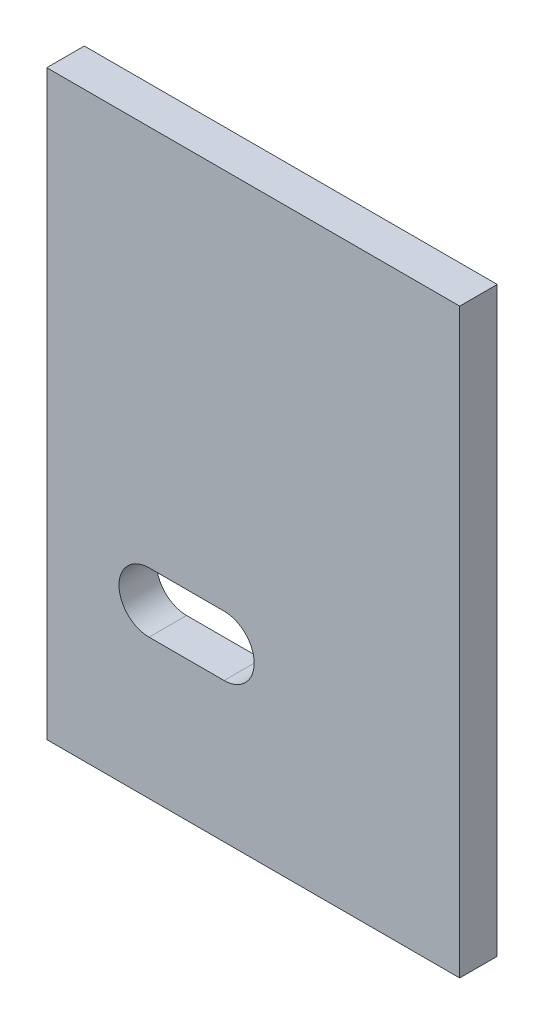
ISO-10303-21;
HEADER;
FILE_DESCRIPTION(('STEP AP214'),'2;1');
FILE_NAME('part.step','',(''),(''),'','','');
FILE_SCHEMA(('AUTOMOTIVE_DESIGN { 1 0 10303 214 1 1 1 1 }'));
ENDSEC;
DATA;
#1=APPLICATION_CONTEXT('core data for automotive mechanical design processes');
#2=APPLICATION_PROTOCOL_DEFINITION('international standard','automotive_design',2000,#1);
#3=PRODUCT_CONTEXT('',#1,'mechanical');
#4=PRODUCT('Part','Part','',(#3));
#5=PRODUCT_RELATED_PRODUCT_CATEGORY('part','',(#4));
#6=PRODUCT_DEFINITION_FORMATION('','',#4);
#7=PRODUCT_DEFINITION_CONTEXT('part definition',#1,'design');
#8=PRODUCT_DEFINITION('design','',#6,#7);
#9=PRODUCT_DEFINITION_SHAPE('','',#8);
#10=(LENGTH_UNIT() NAMED_UNIT(*) SI_UNIT(.MILLI.,.METRE.));
#11=(NAMED_UNIT(*) PLANE_ANGLE_UNIT() SI_UNIT($,.RADIAN.));
#12=(NAMED_UNIT(*) SI_UNIT($,.STERADIAN.) SOLID_ANGLE_UNIT());
#13=UNCERTAINTY_MEASURE_WITH_UNIT(LENGTH_MEASURE(1.E-05),#10,'distance_accuracy_value','');
#14=(GEOMETRIC_REPRESENTATION_CONTEXT(3) GLOBAL_UNCERTAINTY_ASSIGNED_CONTEXT((#13)) GLOBAL_UNIT_ASSIGNED_CONTEXT((#10,
#11,#12)) REPRESENTATION_CONTEXT('',''));
#15=CARTESIAN_POINT('',(0.,0.,0.));
#16=DIRECTION('',(0.,0.,1.));
#17=DIRECTION('',(1.,0.,0.));
#18=AXIS2_PLACEMENT_3D('',#15,#16,#17);
#19=CARTESIAN_POINT('',(55.,-77.5,10.));
#20=DIRECTION('',(-1.,0.,0.));
#21=DIRECTION('',(0.,-1.,0.));
#22=AXIS2_PLACEMENT_3D('',#19,#20,#21);
#23=PLANE('',#22);
#24=DIRECTION('',(0.,1.,0.));
#25=VECTOR('',#24,1.);
#26=CARTESIAN_POINT('',(55.,-77.5,0.));
#27=LINE('',#26,#25);
#28=CARTESIAN_POINT('',(55.,-77.5,0.));
#29=VERTEX_POINT('',#28);
#30=CARTESIAN_POINT('',(55.,77.5,0.));
#31=VERTEX_POINT('',#30);
#32=EDGE_CURVE('E151',#29,#31,#27,.T.);
#33=ORIENTED_EDGE('',*,*,#32,.T.);
#34=DIRECTION('',(0.,0.,-1.));
#35=VECTOR('',#34,1.);
#36=CARTESIAN_POINT('',(55.,77.5,10.));
#37=LINE('',#36,#35);
#38=CARTESIAN_POINT('',(55.,77.5,10.));
#39=VERTEX_POINT('',#38);
#40=EDGE_CURVE('E11',#39,#31,#37,.T.);
#41=ORIENTED_EDGE('',*,*,#40,.F.);
#42=DIRECTION('',(0.,1.,0.));
#43=VECTOR('',#42,1.);
#44=CARTESIAN_POINT('',(55.,-77.5,10.));
#45=LINE('',#44,#43);
#46=CARTESIAN_POINT('',(55.,-77.5,10.));
#47=VERTEX_POINT('',#46);
#48=EDGE_CURVE('E160',#47,#39,#45,.T.);
#49=ORIENTED_EDGE('',*,*,#48,.F.);
#50=DIRECTION('',(0.,0.,-1.));
#51=VECTOR('',#50,1.);
#52=CARTESIAN_POINT('',(55.,-77.5,10.));
#53=LINE('',#52,#51);
#54=EDGE_CURVE('E141',#47,#29,#53,.T.);
#55=ORIENTED_EDGE('',*,*,#54,.T.);
#56=EDGE_LOOP('',(#33,#41,#49,#55));
#57=FACE_BOUND('',#56,.T.);
#58=ADVANCED_FACE('F45',(#57),#23,.F.);
#59=CARTESIAN_POINT('',(-55.,77.5,10.));
#60=DIRECTION('',(0.,-1.,0.));
#61=DIRECTION('',(0.,0.,-1.));
#62=AXIS2_PLACEMENT_3D('',#59,#60,#61);
#63=PLANE('',#62);
#64=DIRECTION('',(-1.,0.,0.));
#65=VECTOR('',#64,1.);
#66=CARTESIAN_POINT('',(-55.,77.5,0.));
#67=LINE('',#66,#65);
#68=CARTESIAN_POINT('',(-55.,77.5,0.));
#69=VERTEX_POINT('',#68);
#70=EDGE_CURVE('E101',#31,#69,#67,.T.);
#71=ORIENTED_EDGE('',*,*,#70,.T.);
#72=DIRECTION('',(0.,0.,-1.));
#73=VECTOR('',#72,1.);
#74=CARTESIAN_POINT('',(-55.,77.5,10.));
#75=LINE('',#74,#73);
#76=CARTESIAN_POINT('',(-55.,77.5,10.));
#77=VERTEX_POINT('',#76);
#78=EDGE_CURVE('E54',#77,#69,#75,.T.);
#79=ORIENTED_EDGE('',*,*,#78,.F.);
#80=DIRECTION('',(-1.,0.,0.));
#81=VECTOR('',#80,1.);
#82=CARTESIAN_POINT('',(-55.,77.5,10.));
#83=LINE('',#82,#81);
#84=EDGE_CURVE('E124',#39,#77,#83,.T.);
#85=ORIENTED_EDGE('',*,*,#84,.F.);
#86=ORIENTED_EDGE('',*,*,#40,.T.);
#87=EDGE_LOOP('',(#71,#79,#85,#86));
#88=FACE_BOUND('',#87,.T.);
#89=ADVANCED_FACE('F198',(#88),#63,.F.);
#90=CARTESIAN_POINT('',(-55.,-77.5,10.));
#91=DIRECTION('',(1.,0.,0.));
#92=DIRECTION('',(0.,1.,0.));
#93=AXIS2_PLACEMENT_3D('',#90,#91,#92);
#94=PLANE('',#93);
#95=DIRECTION('',(0.,-1.,0.));
#96=VECTOR('',#95,1.);
#97=CARTESIAN_POINT('',(-55.,-77.5,0.));
#98=LINE('',#97,#96);
#99=CARTESIAN_POINT('',(-55.,-77.5,0.));
#100=VERTEX_POINT('',#99);
#101=EDGE_CURVE('E109',#69,#100,#98,.T.);
#102=ORIENTED_EDGE('',*,*,#101,.T.);
#103=DIRECTION('',(0.,0.,-1.));
#104=VECTOR('',#103,1.);
#105=CARTESIAN_POINT('',(-55.,-77.5,10.));
#106=LINE('',#105,#104);
#107=CARTESIAN_POINT('',(-55.,-77.5,10.));
#108=VERTEX_POINT('',#107);
#109=EDGE_CURVE('E138',#108,#100,#106,.T.);
#110=ORIENTED_EDGE('',*,*,#109,.F.);
#111=DIRECTION('',(0.,-1.,0.));
#112=VECTOR('',#111,1.);
#113=CARTESIAN_POINT('',(-55.,-77.5,10.));
#114=LINE('',#113,#112);
#115=EDGE_CURVE('E132',#77,#108,#114,.T.);
#116=ORIENTED_EDGE('',*,*,#115,.F.);
#117=ORIENTED_EDGE('',*,*,#78,.T.);
#118=EDGE_LOOP('',(#102,#110,#116,#117));
#119=FACE_BOUND('',#118,.T.);
#120=ADVANCED_FACE('F139',(#119),#94,.F.);
#121=CARTESIAN_POINT('',(-55.,-77.5,10.));
#122=DIRECTION('',(0.,1.,0.));
#123=DIRECTION('',(0.,0.,1.));
#124=AXIS2_PLACEMENT_3D('',#121,#122,#123);
#125=PLANE('',#124);
#126=DIRECTION('',(1.,0.,0.));
#127=VECTOR('',#126,1.);
#128=CARTESIAN_POINT('',(-55.,-77.5,0.));
#129=LINE('',#128,#127);
#130=EDGE_CURVE('E116',#100,#29,#129,.T.);
#131=ORIENTED_EDGE('',*,*,#130,.T.);
#132=ORIENTED_EDGE('',*,*,#54,.F.);
#133=DIRECTION('',(1.,0.,0.));
#134=VECTOR('',#133,1.);
#135=CARTESIAN_POINT('',(-55.,-77.5,10.));
#136=LINE('',#135,#134);
#137=EDGE_CURVE('E135',#108,#47,#136,.T.);
#138=ORIENTED_EDGE('',*,*,#137,.F.);
#139=ORIENTED_EDGE('',*,*,#109,.T.);
#140=EDGE_LOOP('',(#131,#132,#138,#139));
#141=FACE_BOUND('',#140,.T.);
#142=ADVANCED_FACE('F143',(#141),#125,.F.);
#143=CARTESIAN_POINT('',(0.,0.,10.));
#144=DIRECTION('',(0.,0.,-1.));
#145=DIRECTION('',(-1.,0.,0.));
#146=AXIS2_PLACEMENT_3D('',#143,#144,#145);
#147=PLANE('',#146);
#148=DIRECTION('',(1.,0.,0.));
#149=VECTOR('',#148,1.);
#150=CARTESIAN_POINT('',(-27.75,-40.25,10.));
#151=LINE('',#150,#149);
#152=CARTESIAN_POINT('',(-27.75,-40.25,10.));
#153=VERTEX_POINT('',#152);
#154=CARTESIAN_POINT('',(-7.75000000000003,-40.25,10.));
#155=VERTEX_POINT('',#154);
#156=EDGE_CURVE('E164',#153,#155,#151,.T.);
#157=ORIENTED_EDGE('',*,*,#156,.F.);
#158=CARTESIAN_POINT('',(-27.75,-32.25,10.));
#159=DIRECTION('',(0.,0.,1.));
#160=DIRECTION('',(1.,0.,0.));
#161=AXIS2_PLACEMENT_3D('',#158,#159,#160);
#162=CIRCLE('',#161,8.);
#163=CARTESIAN_POINT('',(-27.75,-24.25,10.));
#164=VERTEX_POINT('',#163);
#165=EDGE_CURVE('E48',#164,#153,#162,.T.);
#166=ORIENTED_EDGE('',*,*,#165,.F.);
#167=DIRECTION('',(1.,0.,0.));
#168=VECTOR('',#167,1.);
#169=CARTESIAN_POINT('',(-27.75,-24.25,10.));
#170=LINE('',#169,#168);
#171=CARTESIAN_POINT('',(-7.75000000000003,-24.25,10.));
#172=VERTEX_POINT('',#171);
#173=EDGE_CURVE('E92',#172,#164,#170,.F.);
#174=ORIENTED_EDGE('',*,*,#173,.F.);
#175=CARTESIAN_POINT('',(-7.75000000000003,-32.25,10.));
#176=DIRECTION('',(0.,0.,1.));
#177=DIRECTION('',(1.,0.,0.));
#178=AXIS2_PLACEMENT_3D('',#175,#176,#177);
#179=CIRCLE('',#178,8.);
#180=EDGE_CURVE('E167',#155,#172,#179,.T.);
#181=ORIENTED_EDGE('',*,*,#180,.F.);
#182=EDGE_LOOP('',(#157,#166,#174,#181));
#183=FACE_BOUND('',#182,.T.);
#184=ORIENTED_EDGE('',*,*,#48,.T.);
#185=ORIENTED_EDGE('',*,*,#84,.T.);
#186=ORIENTED_EDGE('',*,*,#115,.T.);
#187=ORIENTED_EDGE('',*,*,#137,.T.);
#188=EDGE_LOOP('',(#184,#185,#186,#187));
#189=FACE_BOUND('',#188,.T.);
#190=ADVANCED_FACE('F133',(#183,#189),#147,.F.);
#191=CARTESIAN_POINT('',(0.,0.,0.));
#192=DIRECTION('',(0.,0.,-1.));
#193=DIRECTION('',(-1.,0.,0.));
#194=AXIS2_PLACEMENT_3D('',#191,#192,#193);
#195=PLANE('',#194);
#196=CARTESIAN_POINT('',(-27.75,-32.25,0.));
#197=DIRECTION('',(0.,0.,1.));
#198=DIRECTION('',(1.,0.,0.));
#199=AXIS2_PLACEMENT_3D('',#196,#197,#198);
#200=CIRCLE('',#199,8.);
#201=CARTESIAN_POINT('',(-27.75,-24.25,0.));
#202=VERTEX_POINT('',#201);
#203=CARTESIAN_POINT('',(-27.75,-40.25,0.));
#204=VERTEX_POINT('',#203);
#205=EDGE_CURVE('E272',#202,#204,#200,.T.);
#206=ORIENTED_EDGE('',*,*,#205,.T.);
#207=DIRECTION('',(1.,0.,0.));
#208=VECTOR('',#207,1.);
#209=CARTESIAN_POINT('',(-27.75,-40.25,0.));
#210=LINE('',#209,#208);
#211=CARTESIAN_POINT('',(-7.75000000000003,-40.25,0.));
#212=VERTEX_POINT('',#211);
#213=EDGE_CURVE('E274',#204,#212,#210,.T.);
#214=ORIENTED_EDGE('',*,*,#213,.T.);
#215=CARTESIAN_POINT('',(-7.75000000000003,-32.25,0.));
#216=DIRECTION('',(0.,0.,1.));
#217=DIRECTION('',(1.,0.,0.));
#218=AXIS2_PLACEMENT_3D('',#215,#216,#217);
#219=CIRCLE('',#218,8.);
#220=CARTESIAN_POINT('',(-7.75000000000003,-24.25,0.));
#221=VERTEX_POINT('',#220);
#222=EDGE_CURVE('E71',#212,#221,#219,.T.);
#223=ORIENTED_EDGE('',*,*,#222,.T.);
#224=DIRECTION('',(-1.,0.,0.));
#225=VECTOR('',#224,1.);
#226=CARTESIAN_POINT('',(-27.75,-24.25,0.));
#227=LINE('',#226,#225);
#228=EDGE_CURVE('E190',#221,#202,#227,.T.);
#229=ORIENTED_EDGE('',*,*,#228,.T.);
#230=EDGE_LOOP('',(#206,#214,#223,#229));
#231=FACE_BOUND('',#230,.T.);
#232=ORIENTED_EDGE('',*,*,#32,.F.);
#233=ORIENTED_EDGE('',*,*,#130,.F.);
#234=ORIENTED_EDGE('',*,*,#101,.F.);
#235=ORIENTED_EDGE('',*,*,#70,.F.);
#236=EDGE_LOOP('',(#232,#233,#234,#235));
#237=FACE_BOUND('',#236,.T.);
#238=ADVANCED_FACE('F199',(#231,#237),#195,.T.);
#239=CARTESIAN_POINT('',(-27.75,-32.25,0.));
#240=DIRECTION('',(0.,0.,1.));
#241=DIRECTION('',(1.,0.,0.));
#242=AXIS2_PLACEMENT_3D('',#239,#240,#241);
#243=CYLINDRICAL_SURFACE('',#242,8.);
#244=DIRECTION('',(0.,0.,1.));
#245=VECTOR('',#244,1.);
#246=CARTESIAN_POINT('',(-27.75,-40.25,0.));
#247=LINE('',#246,#245);
#248=EDGE_CURVE('E62',#204,#153,#247,.T.);
#249=ORIENTED_EDGE('',*,*,#248,.F.);
#250=ORIENTED_EDGE('',*,*,#205,.F.);
#251=DIRECTION('',(0.,0.,1.));
#252=VECTOR('',#251,1.);
#253=CARTESIAN_POINT('',(-27.75,-24.25,0.));
#254=LINE('',#253,#252);
#255=EDGE_CURVE('E168',#202,#164,#254,.T.);
#256=ORIENTED_EDGE('',*,*,#255,.T.);
#257=ORIENTED_EDGE('',*,*,#165,.T.);
#258=EDGE_LOOP('',(#249,#250,#256,#257));
#259=FACE_BOUND('',#258,.T.);
#260=ADVANCED_FACE('F175',(#259),#243,.F.);
#261=CARTESIAN_POINT('',(-27.75,-24.25,0.));
#262=DIRECTION('',(0.,1.,0.));
#263=DIRECTION('',(0.,0.,1.));
#264=AXIS2_PLACEMENT_3D('',#261,#262,#263);
#265=PLANE('',#264);
#266=ORIENTED_EDGE('',*,*,#255,.F.);
#267=ORIENTED_EDGE('',*,*,#228,.F.);
#268=DIRECTION('',(0.,0.,1.));
#269=VECTOR('',#268,1.);
#270=CARTESIAN_POINT('',(-7.75000000000003,-24.25,0.));
#271=LINE('',#270,#269);
#272=EDGE_CURVE('E185',#221,#172,#271,.T.);
#273=ORIENTED_EDGE('',*,*,#272,.T.);
#274=ORIENTED_EDGE('',*,*,#173,.T.);
#275=EDGE_LOOP('',(#266,#267,#273,#274));
#276=FACE_BOUND('',#275,.T.);
#277=ADVANCED_FACE('F207',(#276),#265,.F.);
#278=CARTESIAN_POINT('',(-7.75000000000003,-32.25,0.));
#279=DIRECTION('',(0.,0.,1.));
#280=DIRECTION('',(1.,0.,0.));
#281=AXIS2_PLACEMENT_3D('',#278,#279,#280);
#282=CYLINDRICAL_SURFACE('',#281,8.);
#283=ORIENTED_EDGE('',*,*,#272,.F.);
#284=ORIENTED_EDGE('',*,*,#222,.F.);
#285=DIRECTION('',(0.,0.,1.));
#286=VECTOR('',#285,1.);
#287=CARTESIAN_POINT('',(-7.75000000000003,-40.25,0.));
#288=LINE('',#287,#286);
#289=EDGE_CURVE('E181',#212,#155,#288,.T.);
#290=ORIENTED_EDGE('',*,*,#289,.T.);
#291=ORIENTED_EDGE('',*,*,#180,.T.);
#292=EDGE_LOOP('',(#283,#284,#290,#291));
#293=FACE_BOUND('',#292,.T.);
#294=ADVANCED_FACE('F183',(#293),#282,.F.);
#295=CARTESIAN_POINT('',(-27.75,-40.25,0.));
#296=DIRECTION('',(0.,-1.,0.));
#297=DIRECTION('',(0.,0.,-1.));
#298=AXIS2_PLACEMENT_3D('',#295,#296,#297);
#299=PLANE('',#298);
#300=ORIENTED_EDGE('',*,*,#289,.F.);
#301=ORIENTED_EDGE('',*,*,#213,.F.);
#302=ORIENTED_EDGE('',*,*,#248,.T.);
#303=ORIENTED_EDGE('',*,*,#156,.T.);
#304=EDGE_LOOP('',(#300,#301,#302,#303));
#305=FACE_BOUND('',#304,.T.);
#306=ADVANCED_FACE('F180',(#305),#299,.F.);
#307=CLOSED_SHELL('',(#58,#89,#120,#142,#190,#238,#260,#277,#294,#306));
#308=MANIFOLD_SOLID_BREP('B2',#307);
#309=ADVANCED_BREP_SHAPE_REPRESENTATION('',(#18,#308),#14);
#310=SHAPE_DEFINITION_REPRESENTATION(#9,#309);
ENDSEC;
END-ISO-10303-21;
